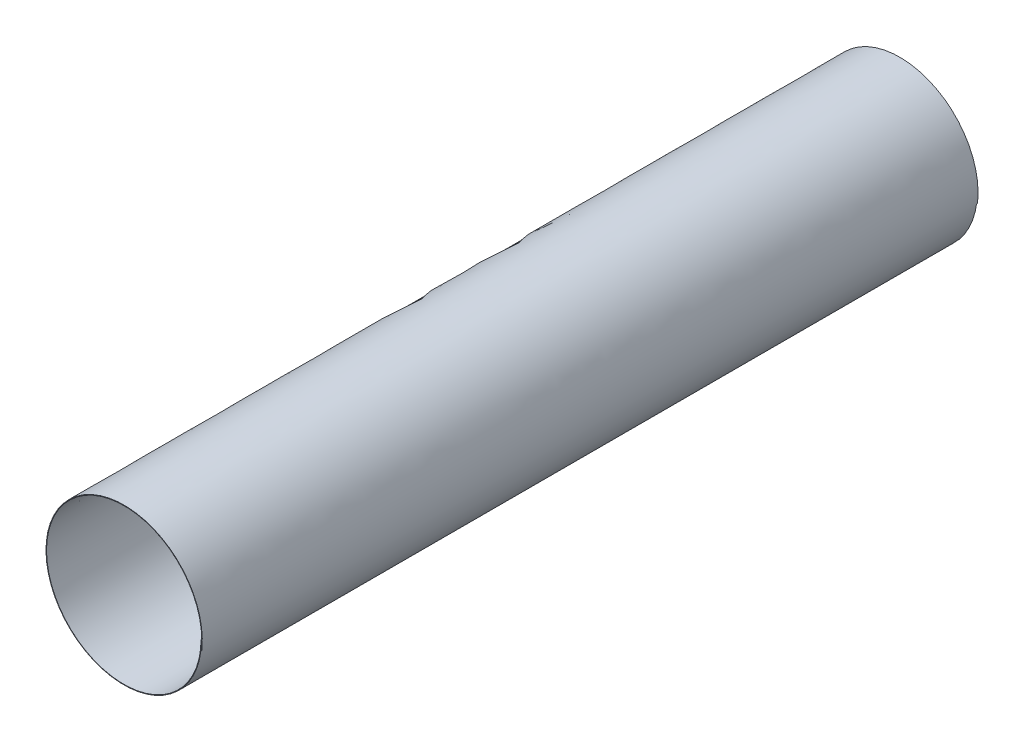
ISO-10303-21;
HEADER;
FILE_DESCRIPTION(('STEP AP214'),'2;1');
FILE_NAME('part.step','',(''),(''),'','','');
FILE_SCHEMA(('AUTOMOTIVE_DESIGN { 1 0 10303 214 1 1 1 1 }'));
ENDSEC;
DATA;
#1=APPLICATION_CONTEXT('core data for automotive mechanical design processes');
#2=APPLICATION_PROTOCOL_DEFINITION('international standard','automotive_design',2000,#1);
#3=PRODUCT_CONTEXT('',#1,'mechanical');
#4=PRODUCT('Part','Part','',(#3));
#5=PRODUCT_RELATED_PRODUCT_CATEGORY('part','',(#4));
#6=PRODUCT_DEFINITION_FORMATION('','',#4);
#7=PRODUCT_DEFINITION_CONTEXT('part definition',#1,'design');
#8=PRODUCT_DEFINITION('design','',#6,#7);
#9=PRODUCT_DEFINITION_SHAPE('','',#8);
#10=(LENGTH_UNIT() NAMED_UNIT(*) SI_UNIT(.MILLI.,.METRE.));
#11=(NAMED_UNIT(*) PLANE_ANGLE_UNIT() SI_UNIT($,.RADIAN.));
#12=(NAMED_UNIT(*) SI_UNIT($,.STERADIAN.) SOLID_ANGLE_UNIT());
#13=UNCERTAINTY_MEASURE_WITH_UNIT(LENGTH_MEASURE(1.E-05),#10,'distance_accuracy_value','');
#14=(GEOMETRIC_REPRESENTATION_CONTEXT(3) GLOBAL_UNCERTAINTY_ASSIGNED_CONTEXT((#13)) GLOBAL_UNIT_ASSIGNED_CONTEXT((#10,
#11,#12)) REPRESENTATION_CONTEXT('',''));
#15=CARTESIAN_POINT('',(0.,0.,0.));
#16=DIRECTION('',(0.,0.,1.));
#17=DIRECTION('',(1.,0.,0.));
#18=AXIS2_PLACEMENT_3D('',#15,#16,#17);
#19=CARTESIAN_POINT('',(151.384001246567,-0.00159154747818974,1524.));
#20=CARTESIAN_POINT('',(151.399832142533,-10.107586365353,1524.));
#21=CARTESIAN_POINT('',(150.400228436736,-20.2171864708377,1524.));
#22=CARTESIAN_POINT('',(146.409007283872,-40.0377258469753,1524.));
#23=CARTESIAN_POINT('',(143.417227509541,-49.7494539710902,1524.));
#24=CARTESIAN_POINT('',(135.56019041423,-68.3856761469638,1524.));
#25=CARTESIAN_POINT('',(130.694617141963,-77.3109108330392,1524.));
#26=CARTESIAN_POINT('',(119.283524318467,-94.0168089662997,1524.));
#27=CARTESIAN_POINT('',(112.737547885429,-101.798135246767,1524.));
#28=CARTESIAN_POINT('',(98.2264830893682,-115.90442514935,1524.));
#29=CARTESIAN_POINT('',(90.2608152349784,-122.229947344023,1524.));
#30=CARTESIAN_POINT('',(73.2281167080248,-133.17088072254,1524.));
#31=CARTESIAN_POINT('',(64.1604071483026,-137.786723936973,1524.));
#32=CARTESIAN_POINT('',(45.2856181726816,-145.122778115292,1524.));
#33=CARTESIAN_POINT('',(35.477787650484,-147.843277353783,1524.));
#34=CARTESIAN_POINT('',(15.5145453313181,-151.27881150033,1524.));
#35=CARTESIAN_POINT('',(5.3583402605376,-151.993979466098,1524.));
#36=CARTESIAN_POINT('',(-14.8957158328951,-151.389148067721,1524.));
#37=CARTESIAN_POINT('',(-24.9943705726292,-150.069121292227,1524.));
#38=CARTESIAN_POINT('',(-44.7294684152852,-145.44556482627,1524.));
#39=CARTESIAN_POINT('',(-54.3666935504003,-142.141848419252,1524.));
#40=CARTESIAN_POINT('',(-72.7933039409288,-133.681929727465,1524.));
#41=CARTESIAN_POINT('',(-81.5834182958793,-128.525388951573,1524.));
#42=CARTESIAN_POINT('',(-97.963841019744,-116.56500178591,1524.));
#43=CARTESIAN_POINT('',(-105.554796436733,-109.760678724163,1524.));
#44=CARTESIAN_POINT('',(-119.232693667325,-94.7759120049355,1524.));
#45=CARTESIAN_POINT('',(-125.320174650643,-86.5948726055061,1524.));
#46=CARTESIAN_POINT('',(-135.746869238215,-69.183059825695,1524.));
#47=CARTESIAN_POINT('',(-140.086492629715,-59.9515954952479,1524.));
#48=CARTESIAN_POINT('',(-146.84297755798,-40.8075035804195,1524.));
#49=CARTESIAN_POINT('',(-149.260103175855,-30.8941174949284,1524.));
#50=CARTESIAN_POINT('',(-152.073879316342,-10.782224279862,1524.));
#51=CARTESIAN_POINT('',(-152.470637720945,-0.582921443375955,1524.));
#52=CARTESIAN_POINT('',(-151.226703279819,19.6931120570181,1524.));
#53=CARTESIAN_POINT('',(-149.585957871575,29.7706438142399,1524.));
#54=CARTESIAN_POINT('',(-144.331506376079,49.4000872839485,1524.));
#55=CARTESIAN_POINT('',(-140.717589451031,58.9527734550214,1524.));
#56=CARTESIAN_POINT('',(-131.660224444102,77.1502440521266,1524.));
#57=CARTESIAN_POINT('',(-126.216415743553,85.7957453590947,1524.));
#58=CARTESIAN_POINT('',(-113.715949506138,101.83263121349,1524.));
#59=CARTESIAN_POINT('',(-106.658796047114,109.224646435789,1524.));
#60=CARTESIAN_POINT('',(-91.2129562893874,122.458279602946,1524.));
#61=CARTESIAN_POINT('',(-82.8236586441954,128.300416845975,1524.));
#62=CARTESIAN_POINT('',(-65.0482709351441,138.199827661166,1524.));
#63=CARTESIAN_POINT('',(-55.6614785845413,142.257488446509,1524.));
#64=CARTESIAN_POINT('',(-36.2659135651907,148.424709202417,1524.));
#65=CARTESIAN_POINT('',(-26.2563757778701,150.534508881017,1524.));
#66=CARTESIAN_POINT('',(-6.01524006357414,152.720572089277,1524.));
#67=CARTESIAN_POINT('',(4.21715520604203,152.796918303887,1524.));
#68=CARTESIAN_POINT('',(24.4949546967843,150.911906431887,1524.));
#69=CARTESIAN_POINT('',(34.541156601953,148.950470769318,1524.));
#70=CARTESIAN_POINT('',(54.0447394072083,143.067211825644,1524.));
#71=CARTESIAN_POINT('',(63.5028864500337,139.145153876694,1524.));
#72=CARTESIAN_POINT('',(81.4518245220307,129.496411071074,1524.));
#73=CARTESIAN_POINT('',(89.9433195442147,123.769343901151,1524.));
#74=CARTESIAN_POINT('',(105.618865736964,110.738607686028,1524.));
#75=CARTESIAN_POINT('',(112.803530639523,103.434424025848,1524.));
#76=CARTESIAN_POINT('',(125.577400133275,87.5406707397397,1524.));
#77=CARTESIAN_POINT('',(131.167103703796,78.9504748222046,1524.));
#78=CARTESIAN_POINT('',(140.526655849666,60.8274976630301,1524.));
#79=CARTESIAN_POINT('',(144.296868757038,51.2940035330479,1524.));
#80=CARTESIAN_POINT('',(149.865680052614,31.6651390252935,1524.));
#81=CARTESIAN_POINT('',(151.664493621115,21.5689976928027,1524.));
#82=CARTESIAN_POINT('',(153.217496207447,1.21825546533534,1524.));
#83=CARTESIAN_POINT('',(152.971742744885,-9.03714338873961,1524.));
#84=CARTESIAN_POINT('',(151.708031157966,-19.1667695335092,1524.));
#85=B_SPLINE_CURVE_WITH_KNOTS('',3,(#19,#20,#21,#22,#23,#24,#25,#26,#27,#28,#29,#30,#31,#32,#33,
#34,#35,#36,#37,#38,#39,#40,#41,#42,#43,#44,#45,#46,#47,#48,#49,#50,#51,#52,#53,#54,#55,#56,#57,
#58,#59,#60,#61,#62,#63,#64,#65,#66,#67,#68,#69,#70,#71,#72,#73,#74,#75,#76,#77,#78,#79,#80,#81,
#82,#83,#84),.UNSPECIFIED.,.F.,.F.,(4,2,2,2,2,2,2,2,2,2,2,2,2,2,2,2,2,2,2,2,2,2,2,2,2,2,2,2,2,2,
2,2,4),(0.,0.03125,0.0625,0.09375,0.125,0.15625,0.1875,0.21875,0.25,0.28125,0.3125,0.34375,
0.375,0.40625,0.4375,0.46875,0.5,0.53125,0.5625,0.59375,0.625,0.65625,0.6875,0.71875,0.75,
0.78125,0.8125,0.84375,0.875,0.90625,0.9375,0.96875,1.),.UNSPECIFIED.);
#86=DIRECTION('',(0.,0.,-1.));
#87=VECTOR('',#86,1.);
#88=SURFACE_OF_LINEAR_EXTRUSION('',#85,#87);
#89=CARTESIAN_POINT('',(151.384001246567,-0.00159154747818974,0.));
#90=CARTESIAN_POINT('',(151.399832142533,-10.107586365353,0.));
#91=CARTESIAN_POINT('',(150.400228436736,-20.2171864708377,0.));
#92=CARTESIAN_POINT('',(146.409007283872,-40.0377258469753,0.));
#93=CARTESIAN_POINT('',(143.417227509541,-49.7494539710902,0.));
#94=CARTESIAN_POINT('',(135.56019041423,-68.3856761469638,0.));
#95=CARTESIAN_POINT('',(130.694617141963,-77.3109108330392,0.));
#96=CARTESIAN_POINT('',(119.283524318467,-94.0168089662997,0.));
#97=CARTESIAN_POINT('',(112.737547885429,-101.798135246767,0.));
#98=CARTESIAN_POINT('',(98.2264830893682,-115.90442514935,0.));
#99=CARTESIAN_POINT('',(90.2608152349784,-122.229947344023,0.));
#100=CARTESIAN_POINT('',(73.2281167080248,-133.17088072254,0.));
#101=CARTESIAN_POINT('',(64.1604071483026,-137.786723936973,0.));
#102=CARTESIAN_POINT('',(45.2856181726816,-145.122778115292,0.));
#103=CARTESIAN_POINT('',(35.477787650484,-147.843277353783,0.));
#104=CARTESIAN_POINT('',(15.5145453313181,-151.27881150033,0.));
#105=CARTESIAN_POINT('',(5.3583402605376,-151.993979466098,0.));
#106=CARTESIAN_POINT('',(-14.8957158328951,-151.389148067721,0.));
#107=CARTESIAN_POINT('',(-24.9943705726292,-150.069121292227,0.));
#108=CARTESIAN_POINT('',(-44.7294684152852,-145.44556482627,0.));
#109=CARTESIAN_POINT('',(-54.3666935504003,-142.141848419252,0.));
#110=CARTESIAN_POINT('',(-72.7933039409288,-133.681929727465,0.));
#111=CARTESIAN_POINT('',(-81.5834182958793,-128.525388951573,0.));
#112=CARTESIAN_POINT('',(-97.963841019744,-116.56500178591,0.));
#113=CARTESIAN_POINT('',(-105.554796436733,-109.760678724163,0.));
#114=CARTESIAN_POINT('',(-119.232693667325,-94.7759120049355,0.));
#115=CARTESIAN_POINT('',(-125.320174650643,-86.5948726055061,0.));
#116=CARTESIAN_POINT('',(-135.746869238215,-69.183059825695,0.));
#117=CARTESIAN_POINT('',(-140.086492629715,-59.9515954952479,0.));
#118=CARTESIAN_POINT('',(-146.84297755798,-40.8075035804195,0.));
#119=CARTESIAN_POINT('',(-149.260103175855,-30.8941174949284,0.));
#120=CARTESIAN_POINT('',(-152.073879316342,-10.782224279862,0.));
#121=CARTESIAN_POINT('',(-152.470637720945,-0.582921443375955,0.));
#122=CARTESIAN_POINT('',(-151.226703279819,19.6931120570181,0.));
#123=CARTESIAN_POINT('',(-149.585957871575,29.7706438142399,0.));
#124=CARTESIAN_POINT('',(-144.331506376079,49.4000872839485,0.));
#125=CARTESIAN_POINT('',(-140.717589451031,58.9527734550214,0.));
#126=CARTESIAN_POINT('',(-131.660224444102,77.1502440521266,0.));
#127=CARTESIAN_POINT('',(-126.216415743553,85.7957453590947,0.));
#128=CARTESIAN_POINT('',(-113.715949506138,101.83263121349,0.));
#129=CARTESIAN_POINT('',(-106.658796047114,109.224646435789,0.));
#130=CARTESIAN_POINT('',(-91.2129562893874,122.458279602946,0.));
#131=CARTESIAN_POINT('',(-82.8236586441954,128.300416845975,0.));
#132=CARTESIAN_POINT('',(-65.0482709351441,138.199827661166,0.));
#133=CARTESIAN_POINT('',(-55.6614785845413,142.257488446509,0.));
#134=CARTESIAN_POINT('',(-36.2659135651907,148.424709202417,0.));
#135=CARTESIAN_POINT('',(-26.2563757778701,150.534508881017,0.));
#136=CARTESIAN_POINT('',(-6.01524006357414,152.720572089277,0.));
#137=CARTESIAN_POINT('',(4.21715520604203,152.796918303887,0.));
#138=CARTESIAN_POINT('',(24.4949546967843,150.911906431887,0.));
#139=CARTESIAN_POINT('',(34.541156601953,148.950470769318,0.));
#140=CARTESIAN_POINT('',(54.0447394072083,143.067211825644,0.));
#141=CARTESIAN_POINT('',(63.5028864500337,139.145153876694,0.));
#142=CARTESIAN_POINT('',(81.4518245220307,129.496411071074,0.));
#143=CARTESIAN_POINT('',(89.9433195442147,123.769343901151,0.));
#144=CARTESIAN_POINT('',(105.618865736964,110.738607686028,0.));
#145=CARTESIAN_POINT('',(112.803530639523,103.434424025848,0.));
#146=CARTESIAN_POINT('',(125.577400133275,87.5406707397397,0.));
#147=CARTESIAN_POINT('',(131.167103703796,78.9504748222046,0.));
#148=CARTESIAN_POINT('',(140.526655849666,60.8274976630301,0.));
#149=CARTESIAN_POINT('',(144.296868757038,51.2940035330479,0.));
#150=CARTESIAN_POINT('',(149.865680052614,31.6651390252935,0.));
#151=CARTESIAN_POINT('',(151.664493621115,21.5689976928027,0.));
#152=CARTESIAN_POINT('',(153.217496207447,1.21825546533534,0.));
#153=CARTESIAN_POINT('',(152.971742744885,-9.03714338873961,0.));
#154=CARTESIAN_POINT('',(151.708031157966,-19.1667695335092,0.));
#155=B_SPLINE_CURVE_WITH_KNOTS('',3,(#89,#90,#91,#92,#93,#94,#95,#96,#97,#98,#99,#100,#101,#102,
#103,#104,#105,#106,#107,#108,#109,#110,#111,#112,#113,#114,#115,#116,#117,#118,#119,#120,#121,
#122,#123,#124,#125,#126,#127,#128,#129,#130,#131,#132,#133,#134,#135,#136,#137,#138,#139,#140,
#141,#142,#143,#144,#145,#146,#147,#148,#149,#150,#151,#152,#153,#154),.UNSPECIFIED.,.F.,.F.,(4,
2,2,2,2,2,2,2,2,2,2,2,2,2,2,2,2,2,2,2,2,2,2,2,2,2,2,2,2,2,2,2,4),(0.,0.03125,0.0625,0.09375,
0.125,0.15625,0.1875,0.21875,0.25,0.28125,0.3125,0.34375,0.375,0.40625,0.4375,0.46875,0.5,
0.53125,0.5625,0.59375,0.625,0.65625,0.6875,0.71875,0.75,0.78125,0.8125,0.84375,0.875,0.90625,
0.9375,0.96875,1.),.UNSPECIFIED.);
#156=CARTESIAN_POINT('',(151.384001246567,-0.00159154747818974,0.));
#157=VERTEX_POINT('',#156);
#158=CARTESIAN_POINT('',(151.708031157966,-19.166769533509,0.));
#159=VERTEX_POINT('',#158);
#160=EDGE_CURVE('E117',#157,#159,#155,.T.);
#161=ORIENTED_EDGE('',*,*,#160,.T.);
#162=DIRECTION('',(0.,0.,-1.));
#163=VECTOR('',#162,1.);
#164=CARTESIAN_POINT('',(151.708031157966,-19.166769533509,1524.));
#165=LINE('',#164,#163);
#166=CARTESIAN_POINT('',(151.708031157966,-19.166769533509,1524.));
#167=VERTEX_POINT('',#166);
#168=EDGE_CURVE('E11',#167,#159,#165,.T.);
#169=ORIENTED_EDGE('',*,*,#168,.F.);
#170=CARTESIAN_POINT('',(151.384001246567,-0.00159154747818974,1524.));
#171=VERTEX_POINT('',#170);
#172=EDGE_CURVE('E80',#171,#167,#85,.T.);
#173=ORIENTED_EDGE('',*,*,#172,.F.);
#174=DIRECTION('',(0.,0.,-1.));
#175=VECTOR('',#174,1.);
#176=CARTESIAN_POINT('',(151.384001246567,-0.00159154747818974,1524.));
#177=LINE('',#176,#175);
#178=EDGE_CURVE('E54',#171,#157,#177,.T.);
#179=ORIENTED_EDGE('',*,*,#178,.T.);
#180=EDGE_LOOP('',(#161,#169,#173,#179));
#181=FACE_BOUND('',#180,.T.);
#182=ADVANCED_FACE('F36',(#181),#88,.F.);
#183=CARTESIAN_POINT('',(152.716215973338,-19.2925446425537,1524.));
#184=DIRECTION('',(-0.123794398665964,-0.992307889144761,0.));
#185=DIRECTION('',(0.992307889144762,-0.123794398665964,0.));
#186=AXIS2_PLACEMENT_3D('',#183,#184,#185);
#187=PLANE('',#186);
#188=DIRECTION('',(-0.992307889144761,0.123794398665964,0.));
#189=VECTOR('',#188,1.);
#190=CARTESIAN_POINT('',(152.716215973338,-19.2925446425537,0.));
#191=LINE('',#190,#189);
#192=CARTESIAN_POINT('',(152.716215973338,-19.2925446425537,0.));
#193=VERTEX_POINT('',#192);
#194=EDGE_CURVE('E86',#193,#159,#191,.T.);
#195=ORIENTED_EDGE('',*,*,#194,.F.);
#196=DIRECTION('',(0.,0.,-1.));
#197=VECTOR('',#196,1.);
#198=CARTESIAN_POINT('',(152.716215973338,-19.2925446425537,1524.));
#199=LINE('',#198,#197);
#200=CARTESIAN_POINT('',(152.716215973338,-19.2925446425537,1524.));
#201=VERTEX_POINT('',#200);
#202=EDGE_CURVE('E50',#201,#193,#199,.T.);
#203=ORIENTED_EDGE('',*,*,#202,.F.);
#204=DIRECTION('',(-0.992307889144761,0.123794398665964,0.));
#205=VECTOR('',#204,1.);
#206=CARTESIAN_POINT('',(152.716215973338,-19.2925446425537,1524.));
#207=LINE('',#206,#205);
#208=EDGE_CURVE('E88',#201,#167,#207,.T.);
#209=ORIENTED_EDGE('',*,*,#208,.T.);
#210=ORIENTED_EDGE('',*,*,#168,.T.);
#211=EDGE_LOOP('',(#195,#203,#209,#210));
#212=FACE_BOUND('',#211,.T.);
#213=ADVANCED_FACE('F82',(#212),#187,.T.);
#214=CARTESIAN_POINT('',(152.4,0.,1524.));
#215=CARTESIAN_POINT('',(152.4159375,-10.1740478086505,1524.));
#216=CARTESIAN_POINT('',(151.40966957205,-20.3510364436938,1524.));
#217=CARTESIAN_POINT('',(147.391580329465,-40.305003663064,1524.));
#218=CARTESIAN_POINT('',(144.379863211171,-50.0814475355265,1524.));
#219=CARTESIAN_POINT('',(136.46995083389,-68.8430853726028,1524.));
#220=CARTESIAN_POINT('',(131.571964130908,-77.8277758849133,1524.));
#221=CARTESIAN_POINT('',(120.084102628022,-94.6460637566123,1524.));
#222=CARTESIAN_POINT('',(113.494532468982,-102.479209076175,1524.));
#223=CARTESIAN_POINT('',(98.8858745770521,-116.680369790939,1524.));
#224=CARTESIAN_POINT('',(90.8671754473948,-123.048002668326,1524.));
#225=CARTESIAN_POINT('',(73.7199608865198,-134.062495283269,1524.));
#226=CARTESIAN_POINT('',(64.591902533098,-138.709057365676,1524.));
#227=CARTESIAN_POINT('',(45.5902525920324,-146.094418527867,1524.));
#228=CARTESIAN_POINT('',(35.7171683208919,-148.833016771721,1524.));
#229=CARTESIAN_POINT('',(15.6197916244602,-152.291634504889,1524.));
#230=CARTESIAN_POINT('',(5.39603649801869,-153.011558069669,1524.));
#231=CARTESIAN_POINT('',(-14.9940650957269,-152.402664048486,1524.));
#232=CARTESIAN_POINT('',(-25.1598657498973,-151.07385935115,1524.));
#233=CARTESIAN_POINT('',(-45.0274815262384,-146.419256464544,1524.));
#234=CARTESIAN_POINT('',(-54.7287641429867,-143.093579529762,1524.));
#235=CARTESIAN_POINT('',(-73.2790672324416,-134.576871762093,1524.));
#236=CARTESIAN_POINT('',(-82.1275898109073,-129.386065768351,1524.));
#237=CARTESIAN_POINT('',(-98.6179351371777,-117.345417128049,1524.));
#238=CARTESIAN_POINT('',(-106.259314534599,-110.495893978675,1524.));
#239=CARTESIAN_POINT('',(-120.028969896369,-95.410601998356,1524.));
#240=CARTESIAN_POINT('',(-126.156874818092,-87.1752346050044,1524.));
#241=CARTESIAN_POINT('',(-136.653494851828,-69.6466514751142,1524.));
#242=CARTESIAN_POINT('',(-141.021926112349,-60.3539031141389,1524.));
#243=CARTESIAN_POINT('',(-147.823708393037,-41.081463887432,1524.));
#244=CARTESIAN_POINT('',(-150.256874158693,-31.1022876858889,1524.));
#245=CARTESIAN_POINT('',(-153.089508706208,-10.8556011363751,1524.));
#246=CARTESIAN_POINT('',(-153.488898300559,-0.588632189116412,1524.));
#247=CARTESIAN_POINT('',(-152.236629418874,19.823252036531,1524.));
#248=CARTESIAN_POINT('',(-150.585001055332,29.9676208118358,1524.));
#249=CARTESIAN_POINT('',(-145.295355457683,49.7285414945861,1524.));
#250=CARTESIAN_POINT('',(-141.657476500116,59.3445636482864,1524.));
#251=CARTESIAN_POINT('',(-132.539464683836,77.6638818831015,1524.));
#252=CARTESIAN_POINT('',(-127.059572803495,86.3666861553476,1524.));
#253=CARTESIAN_POINT('',(-114.475431526517,102.510918970475,1524.));
#254=CARTESIAN_POINT('',(-107.37151623735,109.951913340693,1524.));
#255=CARTESIAN_POINT('',(-91.8223182861213,123.274101383407,1524.));
#256=CARTESIAN_POINT('',(-83.3774495576332,129.15493591815,1524.));
#257=CARTESIAN_POINT('',(-65.4831524506136,139.120569366544,1524.));
#258=CARTESIAN_POINT('',(-56.0342013281684,143.20509858622,1524.));
#259=CARTESIAN_POINT('',(-36.5089293461471,149.413562351628,1524.));
#260=CARTESIAN_POINT('',(-26.4331300189836,151.537327488109,1524.));
#261=CARTESIAN_POINT('',(-6.05667507116061,153.738005310981,1524.));
#262=CARTESIAN_POINT('',(4.2434355694567,153.814855710096,1524.));
#263=CARTESIAN_POINT('',(24.6567569090925,151.917245809687,1524.));
#264=CARTESIAN_POINT('',(34.769420959801,149.942832902503,1524.));
#265=CARTESIAN_POINT('',(54.4033104739205,144.020266918784,1524.));
#266=CARTESIAN_POINT('',(63.9240094803991,140.072269087291,1524.));
#267=CARTESIAN_POINT('',(81.992829851474,130.359081607223,1524.));
#268=CARTESIAN_POINT('',(90.5404660163098,124.594148915242,1524.));
#269=CARTESIAN_POINT('',(106.320677565146,111.476406695399,1524.));
#270=CARTESIAN_POINT('',(113.552828435569,104.123945623208,1524.));
#271=CARTESIAN_POINT('',(126.411962136802,88.1241032402535,1524.));
#272=CARTESIAN_POINT('',(132.038598154448,79.4771480063052,1524.));
#273=CARTESIAN_POINT('',(141.460604753099,61.2332397808165,1524.));
#274=CARTESIAN_POINT('',(145.255720138885,51.6367734965523,1524.));
#275=CARTESIAN_POINT('',(150.861679391764,31.8769704128728,1524.));
#276=CARTESIAN_POINT('',(152.672369943918,21.7141615252964,1524.));
#277=CARTESIAN_POINT('',(154.23572892878,1.22770774219829,1524.));
#278=CARTESIAN_POINT('',(153.988352121295,-9.09538912269368,1524.));
#279=CARTESIAN_POINT('',(152.716215973338,-19.2925446425537,1524.));
#280=B_SPLINE_CURVE_WITH_KNOTS('',3,(#214,#215,#216,#217,#218,#219,#220,#221,#222,#223,#224,
#225,#226,#227,#228,#229,#230,#231,#232,#233,#234,#235,#236,#237,#238,#239,#240,#241,#242,#243,
#244,#245,#246,#247,#248,#249,#250,#251,#252,#253,#254,#255,#256,#257,#258,#259,#260,#261,#262,
#263,#264,#265,#266,#267,#268,#269,#270,#271,#272,#273,#274,#275,#276,#277,#278,#279),
.UNSPECIFIED.,.F.,.F.,(4,2,2,2,2,2,2,2,2,2,2,2,2,2,2,2,2,2,2,2,2,2,2,2,2,2,2,2,2,2,2,2,4),(0.,
0.0312500000000001,0.0625000000000001,0.0937500000000002,0.125,0.15625,0.1875,0.21875,0.25,
0.28125,0.3125,0.34375,0.375,0.40625,0.4375,0.46875,0.5,0.53125,0.5625,0.59375,0.625,0.65625,
0.6875,0.71875,0.75,0.78125,0.8125,0.84375,0.875,0.90625,0.9375,0.96875,1.),.UNSPECIFIED.);
#281=DIRECTION('',(0.,0.,-1.));
#282=VECTOR('',#281,1.);
#283=SURFACE_OF_LINEAR_EXTRUSION('',#280,#282);
#284=CARTESIAN_POINT('',(152.4,0.,0.));
#285=CARTESIAN_POINT('',(152.4159375,-10.1740478086505,0.));
#286=CARTESIAN_POINT('',(151.40966957205,-20.3510364436938,0.));
#287=CARTESIAN_POINT('',(147.391580329465,-40.305003663064,0.));
#288=CARTESIAN_POINT('',(144.379863211171,-50.0814475355265,0.));
#289=CARTESIAN_POINT('',(136.46995083389,-68.8430853726028,0.));
#290=CARTESIAN_POINT('',(131.571964130908,-77.8277758849133,0.));
#291=CARTESIAN_POINT('',(120.084102628022,-94.6460637566123,0.));
#292=CARTESIAN_POINT('',(113.494532468982,-102.479209076175,0.));
#293=CARTESIAN_POINT('',(98.8858745770521,-116.680369790939,0.));
#294=CARTESIAN_POINT('',(90.8671754473948,-123.048002668326,0.));
#295=CARTESIAN_POINT('',(73.7199608865198,-134.062495283269,0.));
#296=CARTESIAN_POINT('',(64.591902533098,-138.709057365676,0.));
#297=CARTESIAN_POINT('',(45.5902525920324,-146.094418527867,0.));
#298=CARTESIAN_POINT('',(35.7171683208919,-148.833016771721,0.));
#299=CARTESIAN_POINT('',(15.6197916244602,-152.291634504889,0.));
#300=CARTESIAN_POINT('',(5.39603649801869,-153.011558069669,0.));
#301=CARTESIAN_POINT('',(-14.9940650957269,-152.402664048486,0.));
#302=CARTESIAN_POINT('',(-25.1598657498973,-151.07385935115,0.));
#303=CARTESIAN_POINT('',(-45.0274815262384,-146.419256464544,0.));
#304=CARTESIAN_POINT('',(-54.7287641429867,-143.093579529762,0.));
#305=CARTESIAN_POINT('',(-73.2790672324416,-134.576871762093,0.));
#306=CARTESIAN_POINT('',(-82.1275898109073,-129.386065768351,0.));
#307=CARTESIAN_POINT('',(-98.6179351371777,-117.345417128049,0.));
#308=CARTESIAN_POINT('',(-106.259314534599,-110.495893978675,0.));
#309=CARTESIAN_POINT('',(-120.028969896369,-95.410601998356,0.));
#310=CARTESIAN_POINT('',(-126.156874818092,-87.1752346050044,0.));
#311=CARTESIAN_POINT('',(-136.653494851828,-69.6466514751142,0.));
#312=CARTESIAN_POINT('',(-141.021926112349,-60.3539031141389,0.));
#313=CARTESIAN_POINT('',(-147.823708393037,-41.081463887432,0.));
#314=CARTESIAN_POINT('',(-150.256874158693,-31.1022876858889,0.));
#315=CARTESIAN_POINT('',(-153.089508706208,-10.8556011363751,0.));
#316=CARTESIAN_POINT('',(-153.488898300559,-0.588632189116412,0.));
#317=CARTESIAN_POINT('',(-152.236629418874,19.823252036531,0.));
#318=CARTESIAN_POINT('',(-150.585001055332,29.9676208118358,0.));
#319=CARTESIAN_POINT('',(-145.295355457683,49.7285414945861,0.));
#320=CARTESIAN_POINT('',(-141.657476500116,59.3445636482864,0.));
#321=CARTESIAN_POINT('',(-132.539464683836,77.6638818831015,0.));
#322=CARTESIAN_POINT('',(-127.059572803495,86.3666861553476,0.));
#323=CARTESIAN_POINT('',(-114.475431526517,102.510918970475,0.));
#324=CARTESIAN_POINT('',(-107.37151623735,109.951913340693,0.));
#325=CARTESIAN_POINT('',(-91.8223182861213,123.274101383407,0.));
#326=CARTESIAN_POINT('',(-83.3774495576332,129.15493591815,0.));
#327=CARTESIAN_POINT('',(-65.4831524506136,139.120569366544,0.));
#328=CARTESIAN_POINT('',(-56.0342013281684,143.20509858622,0.));
#329=CARTESIAN_POINT('',(-36.5089293461471,149.413562351628,0.));
#330=CARTESIAN_POINT('',(-26.4331300189836,151.537327488109,0.));
#331=CARTESIAN_POINT('',(-6.05667507116061,153.738005310981,0.));
#332=CARTESIAN_POINT('',(4.2434355694567,153.814855710096,0.));
#333=CARTESIAN_POINT('',(24.6567569090925,151.917245809687,0.));
#334=CARTESIAN_POINT('',(34.769420959801,149.942832902503,0.));
#335=CARTESIAN_POINT('',(54.4033104739205,144.020266918784,0.));
#336=CARTESIAN_POINT('',(63.9240094803991,140.072269087291,0.));
#337=CARTESIAN_POINT('',(81.992829851474,130.359081607223,0.));
#338=CARTESIAN_POINT('',(90.5404660163098,124.594148915242,0.));
#339=CARTESIAN_POINT('',(106.320677565146,111.476406695399,0.));
#340=CARTESIAN_POINT('',(113.552828435569,104.123945623208,0.));
#341=CARTESIAN_POINT('',(126.411962136802,88.1241032402535,0.));
#342=CARTESIAN_POINT('',(132.038598154448,79.4771480063052,0.));
#343=CARTESIAN_POINT('',(141.460604753099,61.2332397808165,0.));
#344=CARTESIAN_POINT('',(145.255720138885,51.6367734965523,0.));
#345=CARTESIAN_POINT('',(150.861679391764,31.8769704128728,0.));
#346=CARTESIAN_POINT('',(152.672369943918,21.7141615252964,0.));
#347=CARTESIAN_POINT('',(154.23572892878,1.22770774219829,0.));
#348=CARTESIAN_POINT('',(153.988352121295,-9.09538912269368,0.));
#349=CARTESIAN_POINT('',(152.716215973338,-19.2925446425537,0.));
#350=B_SPLINE_CURVE_WITH_KNOTS('',3,(#284,#285,#286,#287,#288,#289,#290,#291,#292,#293,#294,
#295,#296,#297,#298,#299,#300,#301,#302,#303,#304,#305,#306,#307,#308,#309,#310,#311,#312,#313,
#314,#315,#316,#317,#318,#319,#320,#321,#322,#323,#324,#325,#326,#327,#328,#329,#330,#331,#332,
#333,#334,#335,#336,#337,#338,#339,#340,#341,#342,#343,#344,#345,#346,#347,#348,#349),
.UNSPECIFIED.,.F.,.F.,(4,2,2,2,2,2,2,2,2,2,2,2,2,2,2,2,2,2,2,2,2,2,2,2,2,2,2,2,2,2,2,2,4),(0.,
0.0312500000000001,0.0625000000000001,0.0937500000000002,0.125,0.15625,0.1875,0.21875,0.25,
0.28125,0.3125,0.34375,0.375,0.40625,0.4375,0.46875,0.5,0.53125,0.5625,0.59375,0.625,0.65625,
0.6875,0.71875,0.75,0.78125,0.8125,0.84375,0.875,0.90625,0.9375,0.96875,1.),.UNSPECIFIED.);
#351=CARTESIAN_POINT('',(152.4,0.,0.));
#352=VERTEX_POINT('',#351);
#353=EDGE_CURVE('E124',#352,#193,#350,.T.);
#354=ORIENTED_EDGE('',*,*,#353,.F.);
#355=DIRECTION('',(0.,0.,-1.));
#356=VECTOR('',#355,1.);
#357=CARTESIAN_POINT('',(152.4,0.,1524.));
#358=LINE('',#357,#356);
#359=CARTESIAN_POINT('',(152.4,0.,1524.));
#360=VERTEX_POINT('',#359);
#361=EDGE_CURVE('E70',#360,#352,#358,.T.);
#362=ORIENTED_EDGE('',*,*,#361,.F.);
#363=EDGE_CURVE('E94',#360,#201,#280,.T.);
#364=ORIENTED_EDGE('',*,*,#363,.T.);
#365=ORIENTED_EDGE('',*,*,#202,.T.);
#366=EDGE_LOOP('',(#354,#362,#364,#365));
#367=FACE_BOUND('',#366,.T.);
#368=ADVANCED_FACE('F96',(#367),#283,.T.);
#369=CARTESIAN_POINT('',(151.384001246567,-0.00159154747818974,1524.));
#370=DIRECTION('',(-0.00156648373837573,0.999998773063596,0.));
#371=DIRECTION('',(-0.999998773063596,-0.00156648373837573,0.));
#372=AXIS2_PLACEMENT_3D('',#369,#370,#371);
#373=PLANE('',#372);
#374=DIRECTION('',(0.999998773063596,0.00156648373837573,0.));
#375=VECTOR('',#374,1.);
#376=CARTESIAN_POINT('',(151.384001246567,-0.00159154747818974,0.));
#377=LINE('',#376,#375);
#378=EDGE_CURVE('E121',#157,#352,#377,.T.);
#379=ORIENTED_EDGE('',*,*,#378,.F.);
#380=ORIENTED_EDGE('',*,*,#178,.F.);
#381=DIRECTION('',(0.999998773063596,0.00156648373837573,0.));
#382=VECTOR('',#381,1.);
#383=CARTESIAN_POINT('',(151.384001246567,-0.00159154747818974,1524.));
#384=LINE('',#383,#382);
#385=EDGE_CURVE('E100',#171,#360,#384,.T.);
#386=ORIENTED_EDGE('',*,*,#385,.T.);
#387=ORIENTED_EDGE('',*,*,#361,.T.);
#388=EDGE_LOOP('',(#379,#380,#386,#387));
#389=FACE_BOUND('',#388,.T.);
#390=ADVANCED_FACE('F109',(#389),#373,.T.);
#391=CARTESIAN_POINT('',(-151.848670500382,9.55509530682106,1524.));
#392=DIRECTION('',(0.,0.,1.));
#393=DIRECTION('',(0.,1.,0.));
#394=AXIS2_PLACEMENT_3D('',#391,#392,#393);
#395=PLANE('',#394);
#396=ORIENTED_EDGE('',*,*,#172,.T.);
#397=ORIENTED_EDGE('',*,*,#208,.F.);
#398=ORIENTED_EDGE('',*,*,#363,.F.);
#399=ORIENTED_EDGE('',*,*,#385,.F.);
#400=EDGE_LOOP('',(#396,#397,#398,#399));
#401=FACE_BOUND('',#400,.T.);
#402=ADVANCED_FACE('F91',(#401),#395,.T.);
#403=CARTESIAN_POINT('',(-151.848670500382,9.55509530682106,0.));
#404=DIRECTION('',(0.,0.,1.));
#405=DIRECTION('',(0.,1.,0.));
#406=AXIS2_PLACEMENT_3D('',#403,#404,#405);
#407=PLANE('',#406);
#408=ORIENTED_EDGE('',*,*,#160,.F.);
#409=ORIENTED_EDGE('',*,*,#378,.T.);
#410=ORIENTED_EDGE('',*,*,#353,.T.);
#411=ORIENTED_EDGE('',*,*,#194,.T.);
#412=EDGE_LOOP('',(#408,#409,#410,#411));
#413=FACE_BOUND('',#412,.T.);
#414=ADVANCED_FACE('F122',(#413),#407,.F.);
#415=CLOSED_SHELL('',(#182,#213,#368,#390,#402,#414));
#416=MANIFOLD_SOLID_BREP('B2',#415);
#417=ADVANCED_BREP_SHAPE_REPRESENTATION('',(#18,#416),#14);
#418=SHAPE_DEFINITION_REPRESENTATION(#9,#417);
ENDSEC;
END-ISO-10303-21;
